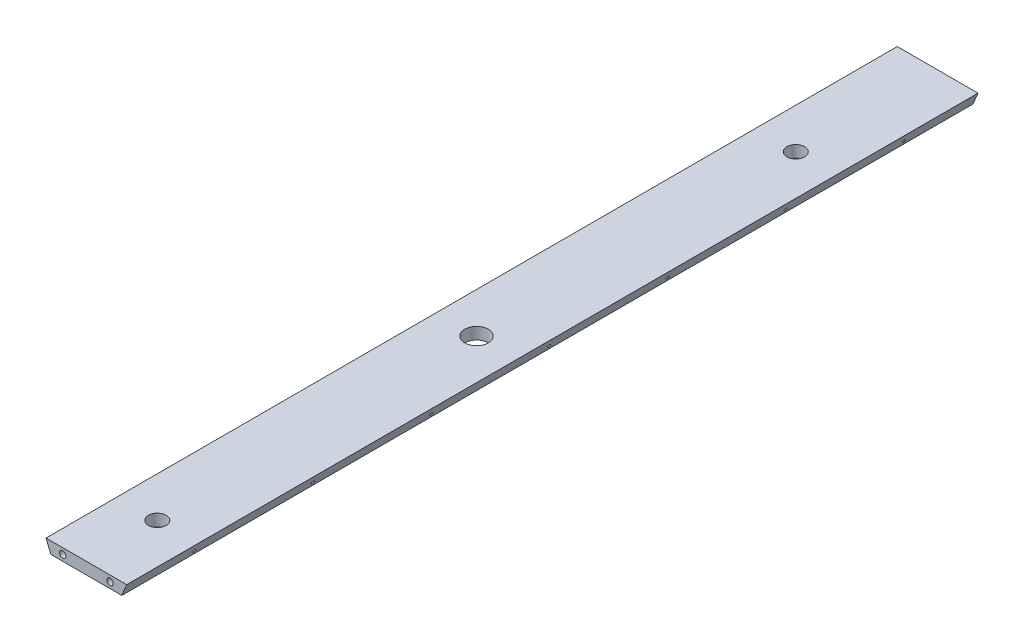
ISO-10303-21;
HEADER;
FILE_DESCRIPTION(('STEP AP214'),'2;1');
FILE_NAME('part.step','',(''),(''),'','','');
FILE_SCHEMA(('AUTOMOTIVE_DESIGN { 1 0 10303 214 1 1 1 1 }'));
ENDSEC;
DATA;
#1=APPLICATION_CONTEXT('core data for automotive mechanical design processes');
#2=APPLICATION_PROTOCOL_DEFINITION('international standard','automotive_design',2000,#1);
#3=PRODUCT_CONTEXT('',#1,'mechanical');
#4=PRODUCT('Part','Part','',(#3));
#5=PRODUCT_RELATED_PRODUCT_CATEGORY('part','',(#4));
#6=PRODUCT_DEFINITION_FORMATION('','',#4);
#7=PRODUCT_DEFINITION_CONTEXT('part definition',#1,'design');
#8=PRODUCT_DEFINITION('design','',#6,#7);
#9=PRODUCT_DEFINITION_SHAPE('','',#8);
#10=(LENGTH_UNIT() NAMED_UNIT(*) SI_UNIT(.MILLI.,.METRE.));
#11=(NAMED_UNIT(*) PLANE_ANGLE_UNIT() SI_UNIT($,.RADIAN.));
#12=(NAMED_UNIT(*) SI_UNIT($,.STERADIAN.) SOLID_ANGLE_UNIT());
#13=UNCERTAINTY_MEASURE_WITH_UNIT(LENGTH_MEASURE(1.E-05),#10,'distance_accuracy_value','');
#14=(GEOMETRIC_REPRESENTATION_CONTEXT(3) GLOBAL_UNCERTAINTY_ASSIGNED_CONTEXT((#13)) GLOBAL_UNIT_ASSIGNED_CONTEXT((#10,
#11,#12)) REPRESENTATION_CONTEXT('',''));
#15=CARTESIAN_POINT('',(0.,0.,0.));
#16=DIRECTION('',(0.,0.,1.));
#17=DIRECTION('',(1.,0.,0.));
#18=AXIS2_PLACEMENT_3D('',#15,#16,#17);
#19=CARTESIAN_POINT('',(19.05,45.9907683632075,457.2));
#20=DIRECTION('',(0.,1.,0.));
#21=DIRECTION('',(0.,0.,1.));
#22=AXIS2_PLACEMENT_3D('',#19,#20,#21);
#23=PLANE('',#22);
#24=CARTESIAN_POINT('',(0.,45.9907683632075,76.2));
#25=DIRECTION('',(0.,1.,0.));
#26=DIRECTION('',(-1.,0.,0.));
#27=AXIS2_PLACEMENT_3D('',#24,#25,#26);
#28=CIRCLE('',#27,4.76250000000001);
#29=CARTESIAN_POINT('',(-4.7625,45.9907683632075,76.2));
#30=VERTEX_POINT('',#29);
#31=EDGE_CURVE('E187',#30,#30,#28,.T.);
#32=ORIENTED_EDGE('',*,*,#31,.T.);
#33=EDGE_LOOP('',(#32));
#34=FACE_BOUND('',#33,.T.);
#35=CARTESIAN_POINT('',(0.,45.9907683632075,419.1));
#36=DIRECTION('',(0.,1.,0.));
#37=DIRECTION('',(-1.,0.,0.));
#38=AXIS2_PLACEMENT_3D('',#35,#36,#37);
#39=CIRCLE('',#38,4.7625);
#40=CARTESIAN_POINT('',(-4.76249999999995,45.9907683632075,419.1));
#41=VERTEX_POINT('',#40);
#42=EDGE_CURVE('E191',#41,#41,#39,.T.);
#43=ORIENTED_EDGE('',*,*,#42,.T.);
#44=EDGE_LOOP('',(#43));
#45=FACE_BOUND('',#44,.T.);
#46=CARTESIAN_POINT('',(0.,45.9907683632075,247.65));
#47=DIRECTION('',(0.,1.,0.));
#48=DIRECTION('',(-1.,0.,0.));
#49=AXIS2_PLACEMENT_3D('',#46,#47,#48);
#50=CIRCLE('',#49,6.35);
#51=CARTESIAN_POINT('',(-6.34999999999996,45.9907683632075,247.65));
#52=VERTEX_POINT('',#51);
#53=EDGE_CURVE('E194',#52,#52,#50,.T.);
#54=ORIENTED_EDGE('',*,*,#53,.T.);
#55=EDGE_LOOP('',(#54));
#56=FACE_BOUND('',#55,.T.);
#57=DIRECTION('',(1.,0.,0.));
#58=VECTOR('',#57,1.);
#59=CARTESIAN_POINT('',(19.05,45.9907683632075,0.));
#60=LINE('',#59,#58);
#61=CARTESIAN_POINT('',(-19.05,45.9907683632075,0.));
#62=VERTEX_POINT('',#61);
#63=CARTESIAN_POINT('',(19.05,45.9907683632075,0.));
#64=VERTEX_POINT('',#63);
#65=EDGE_CURVE('E134',#62,#64,#60,.T.);
#66=ORIENTED_EDGE('',*,*,#65,.T.);
#67=DIRECTION('',(0.,0.,-1.));
#68=VECTOR('',#67,1.);
#69=CARTESIAN_POINT('',(19.05,45.9907683632075,457.2));
#70=LINE('',#69,#68);
#71=CARTESIAN_POINT('',(19.05,45.9907683632075,457.2));
#72=VERTEX_POINT('',#71);
#73=EDGE_CURVE('E12',#72,#64,#70,.T.);
#74=ORIENTED_EDGE('',*,*,#73,.F.);
#75=DIRECTION('',(1.,0.,0.));
#76=VECTOR('',#75,1.);
#77=CARTESIAN_POINT('',(19.05,45.9907683632075,457.2));
#78=LINE('',#77,#76);
#79=CARTESIAN_POINT('',(-19.05,45.9907683632075,457.2));
#80=VERTEX_POINT('',#79);
#81=EDGE_CURVE('E135',#80,#72,#78,.T.);
#82=ORIENTED_EDGE('',*,*,#81,.F.);
#83=DIRECTION('',(0.,0.,-1.));
#84=VECTOR('',#83,1.);
#85=CARTESIAN_POINT('',(-19.05,45.9907683632075,457.2));
#86=LINE('',#85,#84);
#87=EDGE_CURVE('E141',#80,#62,#86,.T.);
#88=ORIENTED_EDGE('',*,*,#87,.T.);
#89=EDGE_LOOP('',(#66,#74,#82,#88));
#90=FACE_BOUND('',#89,.T.);
#91=ADVANCED_FACE('F39',(#34,#45,#56,#90),#23,.F.);
#92=CARTESIAN_POINT('',(21.6802561210692,52.3407683632075,457.2));
#93=DIRECTION('',(-0.923879532511287,0.38268343236509,0.));
#94=DIRECTION('',(-0.38268343236509,-0.923879532511287,0.));
#95=AXIS2_PLACEMENT_3D('',#92,#93,#94);
#96=PLANE('',#95);
#97=CARTESIAN_POINT('',(19.9612649233194,48.1907564999999,38.1));
#98=DIRECTION('',(0.923879532511287,-0.38268343236509,0.));
#99=DIRECTION('',(0.38268343236509,0.923879532511287,0.));
#100=AXIS2_PLACEMENT_3D('',#97,#98,#99);
#101=CIRCLE('',#100,0.793749999999904);
#102=CARTESIAN_POINT('',(20.2650198977592,48.9240858789307,38.1));
#103=VERTEX_POINT('',#102);
#104=EDGE_CURVE('E243',#103,#103,#101,.T.);
#105=ORIENTED_EDGE('',*,*,#104,.F.);
#106=EDGE_LOOP('',(#105));
#107=FACE_BOUND('',#106,.T.);
#108=CARTESIAN_POINT('',(19.9612649233194,48.1907564999999,101.6));
#109=DIRECTION('',(0.923879532511287,-0.38268343236509,0.));
#110=DIRECTION('',(0.38268343236509,0.923879532511287,0.));
#111=AXIS2_PLACEMENT_3D('',#108,#109,#110);
#112=CIRCLE('',#111,0.793749999999917);
#113=CARTESIAN_POINT('',(20.2650198977592,48.9240858789307,101.6));
#114=VERTEX_POINT('',#113);
#115=EDGE_CURVE('E249',#114,#114,#112,.T.);
#116=ORIENTED_EDGE('',*,*,#115,.F.);
#117=EDGE_LOOP('',(#116));
#118=FACE_BOUND('',#117,.T.);
#119=CARTESIAN_POINT('',(19.9612649233194,48.1907564999999,165.1));
#120=DIRECTION('',(0.923879532511287,-0.38268343236509,0.));
#121=DIRECTION('',(0.38268343236509,0.923879532511287,0.));
#122=AXIS2_PLACEMENT_3D('',#119,#120,#121);
#123=CIRCLE('',#122,0.793749999999904);
#124=CARTESIAN_POINT('',(20.2650198977591,48.9240858789307,165.1));
#125=VERTEX_POINT('',#124);
#126=EDGE_CURVE('E255',#125,#125,#123,.T.);
#127=ORIENTED_EDGE('',*,*,#126,.F.);
#128=EDGE_LOOP('',(#127));
#129=FACE_BOUND('',#128,.T.);
#130=CARTESIAN_POINT('',(19.9612649233194,48.1907564999999,228.6));
#131=DIRECTION('',(0.923879532511287,-0.38268343236509,0.));
#132=DIRECTION('',(0.38268343236509,0.923879532511287,0.));
#133=AXIS2_PLACEMENT_3D('',#130,#131,#132);
#134=CIRCLE('',#133,0.793749999999906);
#135=CARTESIAN_POINT('',(20.2650198977591,48.9240858789307,228.6));
#136=VERTEX_POINT('',#135);
#137=EDGE_CURVE('E261',#136,#136,#134,.T.);
#138=ORIENTED_EDGE('',*,*,#137,.F.);
#139=EDGE_LOOP('',(#138));
#140=FACE_BOUND('',#139,.T.);
#141=CARTESIAN_POINT('',(19.9612649233194,48.1907564999999,292.1));
#142=DIRECTION('',(0.923879532511287,-0.38268343236509,0.));
#143=DIRECTION('',(0.38268343236509,0.923879532511287,0.));
#144=AXIS2_PLACEMENT_3D('',#141,#142,#143);
#145=CIRCLE('',#144,0.793749999999908);
#146=CARTESIAN_POINT('',(20.2650198977591,48.9240858789307,292.1));
#147=VERTEX_POINT('',#146);
#148=EDGE_CURVE('E267',#147,#147,#145,.T.);
#149=ORIENTED_EDGE('',*,*,#148,.F.);
#150=EDGE_LOOP('',(#149));
#151=FACE_BOUND('',#150,.T.);
#152=CARTESIAN_POINT('',(19.9612649233194,48.1907564999999,355.6));
#153=DIRECTION('',(0.923879532511287,-0.38268343236509,0.));
#154=DIRECTION('',(0.38268343236509,0.923879532511287,0.));
#155=AXIS2_PLACEMENT_3D('',#152,#153,#154);
#156=CIRCLE('',#155,0.793749999999908);
#157=CARTESIAN_POINT('',(20.2650198977591,48.9240858789306,355.6));
#158=VERTEX_POINT('',#157);
#159=EDGE_CURVE('E273',#158,#158,#156,.T.);
#160=ORIENTED_EDGE('',*,*,#159,.F.);
#161=EDGE_LOOP('',(#160));
#162=FACE_BOUND('',#161,.T.);
#163=CARTESIAN_POINT('',(19.9612649233194,48.1907564999999,419.1));
#164=DIRECTION('',(0.923879532511287,-0.38268343236509,0.));
#165=DIRECTION('',(0.38268343236509,0.923879532511287,0.));
#166=AXIS2_PLACEMENT_3D('',#163,#164,#165);
#167=CIRCLE('',#166,0.793749999999906);
#168=CARTESIAN_POINT('',(20.2650198977591,48.9240858789306,419.1));
#169=VERTEX_POINT('',#168);
#170=EDGE_CURVE('E279',#169,#169,#167,.T.);
#171=ORIENTED_EDGE('',*,*,#170,.F.);
#172=EDGE_LOOP('',(#171));
#173=FACE_BOUND('',#172,.T.);
#174=DIRECTION('',(0.38268343236509,0.923879532511287,0.));
#175=VECTOR('',#174,1.);
#176=CARTESIAN_POINT('',(21.6802561210692,52.3407683632075,0.));
#177=LINE('',#176,#175);
#178=CARTESIAN_POINT('',(21.6802561210692,52.3407683632075,0.));
#179=VERTEX_POINT('',#178);
#180=EDGE_CURVE('E144',#64,#179,#177,.T.);
#181=ORIENTED_EDGE('',*,*,#180,.T.);
#182=DIRECTION('',(0.,0.,-1.));
#183=VECTOR('',#182,1.);
#184=CARTESIAN_POINT('',(21.6802561210692,52.3407683632075,457.2));
#185=LINE('',#184,#183);
#186=CARTESIAN_POINT('',(21.6802561210692,52.3407683632075,457.2));
#187=VERTEX_POINT('',#186);
#188=EDGE_CURVE('E47',#187,#179,#185,.T.);
#189=ORIENTED_EDGE('',*,*,#188,.F.);
#190=DIRECTION('',(0.38268343236509,0.923879532511287,0.));
#191=VECTOR('',#190,1.);
#192=CARTESIAN_POINT('',(21.6802561210692,52.3407683632075,457.2));
#193=LINE('',#192,#191);
#194=EDGE_CURVE('E86',#72,#187,#193,.T.);
#195=ORIENTED_EDGE('',*,*,#194,.F.);
#196=ORIENTED_EDGE('',*,*,#73,.T.);
#197=EDGE_LOOP('',(#181,#189,#195,#196));
#198=FACE_BOUND('',#197,.T.);
#199=ADVANCED_FACE('F171',(#107,#118,#129,#140,#151,#162,#173,#198),#96,.F.);
#200=CARTESIAN_POINT('',(-21.6802561210692,52.3407683632075,457.2));
#201=DIRECTION('',(0.,-1.,0.));
#202=DIRECTION('',(1.,0.,0.));
#203=AXIS2_PLACEMENT_3D('',#200,#201,#202);
#204=PLANE('',#203);
#205=CARTESIAN_POINT('',(0.,52.3407683632075,76.2));
#206=DIRECTION('',(0.,1.,0.));
#207=DIRECTION('',(-1.,0.,0.));
#208=AXIS2_PLACEMENT_3D('',#205,#206,#207);
#209=CIRCLE('',#208,4.76250000000001);
#210=CARTESIAN_POINT('',(-4.7625,52.3407683632075,76.2));
#211=VERTEX_POINT('',#210);
#212=EDGE_CURVE('E734',#211,#211,#209,.T.);
#213=ORIENTED_EDGE('',*,*,#212,.F.);
#214=EDGE_LOOP('',(#213));
#215=FACE_BOUND('',#214,.T.);
#216=CARTESIAN_POINT('',(0.,52.3407683632075,419.1));
#217=DIRECTION('',(0.,1.,0.));
#218=DIRECTION('',(-1.,0.,0.));
#219=AXIS2_PLACEMENT_3D('',#216,#217,#218);
#220=CIRCLE('',#219,4.7625);
#221=CARTESIAN_POINT('',(-4.76249999999994,52.3407683632075,419.1));
#222=VERTEX_POINT('',#221);
#223=EDGE_CURVE('E204',#222,#222,#220,.T.);
#224=ORIENTED_EDGE('',*,*,#223,.F.);
#225=EDGE_LOOP('',(#224));
#226=FACE_BOUND('',#225,.T.);
#227=CARTESIAN_POINT('',(0.,52.3407683632075,247.65));
#228=DIRECTION('',(0.,1.,0.));
#229=DIRECTION('',(-1.,0.,0.));
#230=AXIS2_PLACEMENT_3D('',#227,#228,#229);
#231=CIRCLE('',#230,6.35);
#232=CARTESIAN_POINT('',(-6.34999999999996,52.3407683632075,247.65));
#233=VERTEX_POINT('',#232);
#234=EDGE_CURVE('E197',#233,#233,#231,.T.);
#235=ORIENTED_EDGE('',*,*,#234,.F.);
#236=EDGE_LOOP('',(#235));
#237=FACE_BOUND('',#236,.T.);
#238=DIRECTION('',(-1.,0.,0.));
#239=VECTOR('',#238,1.);
#240=CARTESIAN_POINT('',(-21.6802561210692,52.3407683632075,0.));
#241=LINE('',#240,#239);
#242=CARTESIAN_POINT('',(-21.6802561210692,52.3407683632075,0.));
#243=VERTEX_POINT('',#242);
#244=EDGE_CURVE('E73',#179,#243,#241,.T.);
#245=ORIENTED_EDGE('',*,*,#244,.T.);
#246=DIRECTION('',(0.,0.,-1.));
#247=VECTOR('',#246,1.);
#248=CARTESIAN_POINT('',(-21.6802561210692,52.3407683632075,457.2));
#249=LINE('',#248,#247);
#250=CARTESIAN_POINT('',(-21.6802561210692,52.3407683632075,457.2));
#251=VERTEX_POINT('',#250);
#252=EDGE_CURVE('E149',#251,#243,#249,.T.);
#253=ORIENTED_EDGE('',*,*,#252,.F.);
#254=DIRECTION('',(-1.,0.,0.));
#255=VECTOR('',#254,1.);
#256=CARTESIAN_POINT('',(-21.6802561210692,52.3407683632075,457.2));
#257=LINE('',#256,#255);
#258=EDGE_CURVE('E138',#187,#251,#257,.T.);
#259=ORIENTED_EDGE('',*,*,#258,.F.);
#260=ORIENTED_EDGE('',*,*,#188,.T.);
#261=EDGE_LOOP('',(#245,#253,#259,#260));
#262=FACE_BOUND('',#261,.T.);
#263=ADVANCED_FACE('F151',(#215,#226,#237,#262),#204,.F.);
#264=CARTESIAN_POINT('',(-19.05,45.9907683632075,457.2));
#265=DIRECTION('',(0.923879532511287,0.38268343236509,0.));
#266=DIRECTION('',(-0.38268343236509,0.923879532511287,0.));
#267=AXIS2_PLACEMENT_3D('',#264,#265,#266);
#268=PLANE('',#267);
#269=CARTESIAN_POINT('',(-19.9612649233194,48.1907564999999,38.1));
#270=DIRECTION('',(0.923879532511287,0.38268343236509,0.));
#271=DIRECTION('',(-0.38268343236509,0.923879532511287,0.));
#272=AXIS2_PLACEMENT_3D('',#269,#270,#271);
#273=CIRCLE('',#272,0.793749999999904);
#274=CARTESIAN_POINT('',(-20.2650198977592,48.9240858789307,38.1));
#275=VERTEX_POINT('',#274);
#276=EDGE_CURVE('E196',#275,#275,#273,.T.);
#277=ORIENTED_EDGE('',*,*,#276,.T.);
#278=EDGE_LOOP('',(#277));
#279=FACE_BOUND('',#278,.T.);
#280=CARTESIAN_POINT('',(-19.9612649233194,48.1907564999999,101.6));
#281=DIRECTION('',(0.923879532511287,0.38268343236509,0.));
#282=DIRECTION('',(-0.38268343236509,0.923879532511287,0.));
#283=AXIS2_PLACEMENT_3D('',#280,#281,#282);
#284=CIRCLE('',#283,0.793749999999917);
#285=CARTESIAN_POINT('',(-20.2650198977592,48.9240858789307,101.6));
#286=VERTEX_POINT('',#285);
#287=EDGE_CURVE('E208',#286,#286,#284,.T.);
#288=ORIENTED_EDGE('',*,*,#287,.T.);
#289=EDGE_LOOP('',(#288));
#290=FACE_BOUND('',#289,.T.);
#291=CARTESIAN_POINT('',(-19.9612649233194,48.1907564999999,165.1));
#292=DIRECTION('',(0.923879532511287,0.38268343236509,0.));
#293=DIRECTION('',(-0.38268343236509,0.923879532511287,0.));
#294=AXIS2_PLACEMENT_3D('',#291,#292,#293);
#295=CIRCLE('',#294,0.793749999999904);
#296=CARTESIAN_POINT('',(-20.2650198977591,48.9240858789307,165.1));
#297=VERTEX_POINT('',#296);
#298=EDGE_CURVE('E213',#297,#297,#295,.T.);
#299=ORIENTED_EDGE('',*,*,#298,.T.);
#300=EDGE_LOOP('',(#299));
#301=FACE_BOUND('',#300,.T.);
#302=CARTESIAN_POINT('',(-19.9612649233194,48.1907564999999,228.6));
#303=DIRECTION('',(0.923879532511287,0.38268343236509,0.));
#304=DIRECTION('',(-0.38268343236509,0.923879532511287,0.));
#305=AXIS2_PLACEMENT_3D('',#302,#303,#304);
#306=CIRCLE('',#305,0.793749999999906);
#307=CARTESIAN_POINT('',(-20.2650198977591,48.9240858789307,228.6));
#308=VERTEX_POINT('',#307);
#309=EDGE_CURVE('E219',#308,#308,#306,.T.);
#310=ORIENTED_EDGE('',*,*,#309,.T.);
#311=EDGE_LOOP('',(#310));
#312=FACE_BOUND('',#311,.T.);
#313=CARTESIAN_POINT('',(-19.9612649233194,48.1907564999999,292.1));
#314=DIRECTION('',(0.923879532511287,0.38268343236509,0.));
#315=DIRECTION('',(-0.38268343236509,0.923879532511287,0.));
#316=AXIS2_PLACEMENT_3D('',#313,#314,#315);
#317=CIRCLE('',#316,0.793749999999908);
#318=CARTESIAN_POINT('',(-20.2650198977591,48.9240858789307,292.1));
#319=VERTEX_POINT('',#318);
#320=EDGE_CURVE('E225',#319,#319,#317,.T.);
#321=ORIENTED_EDGE('',*,*,#320,.T.);
#322=EDGE_LOOP('',(#321));
#323=FACE_BOUND('',#322,.T.);
#324=CARTESIAN_POINT('',(-19.9612649233194,48.1907564999999,355.6));
#325=DIRECTION('',(0.923879532511287,0.38268343236509,0.));
#326=DIRECTION('',(-0.38268343236509,0.923879532511287,0.));
#327=AXIS2_PLACEMENT_3D('',#324,#325,#326);
#328=CIRCLE('',#327,0.793749999999908);
#329=CARTESIAN_POINT('',(-20.2650198977591,48.9240858789306,355.6));
#330=VERTEX_POINT('',#329);
#331=EDGE_CURVE('E231',#330,#330,#328,.T.);
#332=ORIENTED_EDGE('',*,*,#331,.T.);
#333=EDGE_LOOP('',(#332));
#334=FACE_BOUND('',#333,.T.);
#335=CARTESIAN_POINT('',(-19.9612649233194,48.1907564999999,419.1));
#336=DIRECTION('',(0.923879532511287,0.38268343236509,0.));
#337=DIRECTION('',(-0.38268343236509,0.923879532511287,0.));
#338=AXIS2_PLACEMENT_3D('',#335,#336,#337);
#339=CIRCLE('',#338,0.793749999999906);
#340=CARTESIAN_POINT('',(-20.2650198977591,48.9240858789306,419.1));
#341=VERTEX_POINT('',#340);
#342=EDGE_CURVE('E237',#341,#341,#339,.T.);
#343=ORIENTED_EDGE('',*,*,#342,.T.);
#344=EDGE_LOOP('',(#343));
#345=FACE_BOUND('',#344,.T.);
#346=DIRECTION('',(0.38268343236509,-0.923879532511287,0.));
#347=VECTOR('',#346,1.);
#348=CARTESIAN_POINT('',(-19.05,45.9907683632075,0.));
#349=LINE('',#348,#347);
#350=EDGE_CURVE('E79',#243,#62,#349,.T.);
#351=ORIENTED_EDGE('',*,*,#350,.T.);
#352=ORIENTED_EDGE('',*,*,#87,.F.);
#353=DIRECTION('',(0.38268343236509,-0.923879532511287,0.));
#354=VECTOR('',#353,1.);
#355=CARTESIAN_POINT('',(-19.05,45.9907683632075,457.2));
#356=LINE('',#355,#354);
#357=EDGE_CURVE('E55',#251,#80,#356,.T.);
#358=ORIENTED_EDGE('',*,*,#357,.F.);
#359=ORIENTED_EDGE('',*,*,#252,.T.);
#360=EDGE_LOOP('',(#351,#352,#358,#359));
#361=FACE_BOUND('',#360,.T.);
#362=ADVANCED_FACE('F158',(#279,#290,#301,#312,#323,#334,#345,#361),#268,.F.);
#363=CARTESIAN_POINT('',(0.,0.,457.2));
#364=DIRECTION('',(0.,0.,-1.));
#365=DIRECTION('',(-1.,0.,0.));
#366=AXIS2_PLACEMENT_3D('',#363,#364,#365);
#367=PLANE('',#366);
#368=CARTESIAN_POINT('',(-12.7,49.1657683632075,457.2));
#369=DIRECTION('',(0.,0.,1.));
#370=DIRECTION('',(1.,0.,0.));
#371=AXIS2_PLACEMENT_3D('',#368,#369,#370);
#372=CIRCLE('',#371,1.72719999999999);
#373=CARTESIAN_POINT('',(-10.9728,49.1657683632075,457.2));
#374=VERTEX_POINT('',#373);
#375=EDGE_CURVE('E110',#374,#374,#372,.T.);
#376=ORIENTED_EDGE('',*,*,#375,.F.);
#377=EDGE_LOOP('',(#376));
#378=FACE_BOUND('',#377,.T.);
#379=CARTESIAN_POINT('',(12.7,49.1657683632075,457.2));
#380=DIRECTION('',(0.,0.,1.));
#381=DIRECTION('',(1.,0.,0.));
#382=AXIS2_PLACEMENT_3D('',#379,#380,#381);
#383=CIRCLE('',#382,1.72719999999999);
#384=CARTESIAN_POINT('',(14.4272,49.1657683632075,457.2));
#385=VERTEX_POINT('',#384);
#386=EDGE_CURVE('E109',#385,#385,#383,.T.);
#387=ORIENTED_EDGE('',*,*,#386,.F.);
#388=EDGE_LOOP('',(#387));
#389=FACE_BOUND('',#388,.T.);
#390=ORIENTED_EDGE('',*,*,#81,.T.);
#391=ORIENTED_EDGE('',*,*,#194,.T.);
#392=ORIENTED_EDGE('',*,*,#258,.T.);
#393=ORIENTED_EDGE('',*,*,#357,.T.);
#394=EDGE_LOOP('',(#390,#391,#392,#393));
#395=FACE_BOUND('',#394,.T.);
#396=ADVANCED_FACE('F160',(#378,#389,#395),#367,.F.);
#397=CARTESIAN_POINT('',(0.,0.,0.));
#398=DIRECTION('',(0.,0.,-1.));
#399=DIRECTION('',(-1.,0.,0.));
#400=AXIS2_PLACEMENT_3D('',#397,#398,#399);
#401=PLANE('',#400);
#402=CARTESIAN_POINT('',(-12.7,49.1657683632075,0.));
#403=DIRECTION('',(0.,0.,-1.));
#404=DIRECTION('',(-1.,0.,0.));
#405=AXIS2_PLACEMENT_3D('',#402,#403,#404);
#406=CIRCLE('',#405,1.72719999999999);
#407=CARTESIAN_POINT('',(-14.4272,49.1657683632075,0.));
#408=VERTEX_POINT('',#407);
#409=EDGE_CURVE('E122',#408,#408,#406,.T.);
#410=ORIENTED_EDGE('',*,*,#409,.F.);
#411=EDGE_LOOP('',(#410));
#412=FACE_BOUND('',#411,.T.);
#413=CARTESIAN_POINT('',(12.7,49.1657683632075,0.));
#414=DIRECTION('',(0.,0.,-1.));
#415=DIRECTION('',(-1.,0.,0.));
#416=AXIS2_PLACEMENT_3D('',#413,#414,#415);
#417=CIRCLE('',#416,1.72719999999999);
#418=CARTESIAN_POINT('',(10.9728,49.1657683632075,0.));
#419=VERTEX_POINT('',#418);
#420=EDGE_CURVE('E128',#419,#419,#417,.T.);
#421=ORIENTED_EDGE('',*,*,#420,.F.);
#422=EDGE_LOOP('',(#421));
#423=FACE_BOUND('',#422,.T.);
#424=ORIENTED_EDGE('',*,*,#65,.F.);
#425=ORIENTED_EDGE('',*,*,#350,.F.);
#426=ORIENTED_EDGE('',*,*,#244,.F.);
#427=ORIENTED_EDGE('',*,*,#180,.F.);
#428=EDGE_LOOP('',(#424,#425,#426,#427));
#429=FACE_BOUND('',#428,.T.);
#430=ADVANCED_FACE('F154',(#412,#423,#429),#401,.T.);
#431=CARTESIAN_POINT('',(12.7,49.1657683632075,25.4));
#432=DIRECTION('',(0.,0.,-1.));
#433=DIRECTION('',(-1.,0.,0.));
#434=AXIS2_PLACEMENT_3D('',#431,#432,#433);
#435=CONICAL_SURFACE('',#434,1.7272,1.02974425867665);
#436=CARTESIAN_POINT('',(12.7,49.1657683632075,26.4378064611844));
#437=VERTEX_POINT('',#436);
#438=VERTEX_LOOP('',#437);
#439=FACE_BOUND('',#438,.T.);
#440=CARTESIAN_POINT('',(12.7,49.1657683632075,25.4));
#441=DIRECTION('',(0.,0.,-1.));
#442=DIRECTION('',(-1.,0.,0.));
#443=AXIS2_PLACEMENT_3D('',#440,#441,#442);
#444=CIRCLE('',#443,1.7272);
#445=CARTESIAN_POINT('',(10.9728,49.1657683632075,25.4));
#446=VERTEX_POINT('',#445);
#447=EDGE_CURVE('E131',#446,#446,#444,.T.);
#448=ORIENTED_EDGE('',*,*,#447,.T.);
#449=EDGE_LOOP('',(#448));
#450=FACE_BOUND('',#449,.T.);
#451=ADVANCED_FACE('F322',(#439,#450),#435,.F.);
#452=CARTESIAN_POINT('',(12.7,49.1657683632075,0.));
#453=DIRECTION('',(0.,0.,-1.));
#454=DIRECTION('',(-1.,0.,0.));
#455=AXIS2_PLACEMENT_3D('',#452,#453,#454);
#456=CYLINDRICAL_SURFACE('',#455,1.72719999999999);
#457=ORIENTED_EDGE('',*,*,#447,.F.);
#458=EDGE_LOOP('',(#457));
#459=FACE_BOUND('',#458,.T.);
#460=ORIENTED_EDGE('',*,*,#420,.T.);
#461=EDGE_LOOP('',(#460));
#462=FACE_BOUND('',#461,.T.);
#463=ADVANCED_FACE('F318',(#459,#462),#456,.F.);
#464=CARTESIAN_POINT('',(-12.7,49.1657683632075,25.4));
#465=DIRECTION('',(0.,0.,-1.));
#466=DIRECTION('',(-1.,0.,0.));
#467=AXIS2_PLACEMENT_3D('',#464,#465,#466);
#468=CONICAL_SURFACE('',#467,1.7272,1.02974425867665);
#469=CARTESIAN_POINT('',(-12.7,49.1657683632075,26.4378064611844));
#470=VERTEX_POINT('',#469);
#471=VERTEX_LOOP('',#470);
#472=FACE_BOUND('',#471,.T.);
#473=CARTESIAN_POINT('',(-12.7,49.1657683632075,25.4));
#474=DIRECTION('',(0.,0.,-1.));
#475=DIRECTION('',(-1.,0.,0.));
#476=AXIS2_PLACEMENT_3D('',#473,#474,#475);
#477=CIRCLE('',#476,1.7272);
#478=CARTESIAN_POINT('',(-14.4272,49.1657683632075,25.4));
#479=VERTEX_POINT('',#478);
#480=EDGE_CURVE('E125',#479,#479,#477,.T.);
#481=ORIENTED_EDGE('',*,*,#480,.T.);
#482=EDGE_LOOP('',(#481));
#483=FACE_BOUND('',#482,.T.);
#484=ADVANCED_FACE('F314',(#472,#483),#468,.F.);
#485=CARTESIAN_POINT('',(-12.7,49.1657683632075,0.));
#486=DIRECTION('',(0.,0.,-1.));
#487=DIRECTION('',(-1.,0.,0.));
#488=AXIS2_PLACEMENT_3D('',#485,#486,#487);
#489=CYLINDRICAL_SURFACE('',#488,1.72719999999999);
#490=ORIENTED_EDGE('',*,*,#480,.F.);
#491=EDGE_LOOP('',(#490));
#492=FACE_BOUND('',#491,.T.);
#493=ORIENTED_EDGE('',*,*,#409,.T.);
#494=EDGE_LOOP('',(#493));
#495=FACE_BOUND('',#494,.T.);
#496=ADVANCED_FACE('F310',(#492,#495),#489,.F.);
#497=CARTESIAN_POINT('',(12.7,49.1657683632075,431.8));
#498=DIRECTION('',(0.,0.,1.));
#499=DIRECTION('',(1.,0.,0.));
#500=AXIS2_PLACEMENT_3D('',#497,#498,#499);
#501=CONICAL_SURFACE('',#500,1.7272,1.02974425867665);
#502=CARTESIAN_POINT('',(12.7,49.1657683632075,430.762193538816));
#503=VERTEX_POINT('',#502);
#504=VERTEX_LOOP('',#503);
#505=FACE_BOUND('',#504,.T.);
#506=CARTESIAN_POINT('',(12.7,49.1657683632075,431.8));
#507=DIRECTION('',(0.,0.,1.));
#508=DIRECTION('',(1.,0.,0.));
#509=AXIS2_PLACEMENT_3D('',#506,#507,#508);
#510=CIRCLE('',#509,1.7272);
#511=CARTESIAN_POINT('',(14.4272,49.1657683632075,431.8));
#512=VERTEX_POINT('',#511);
#513=EDGE_CURVE('E113',#512,#512,#510,.T.);
#514=ORIENTED_EDGE('',*,*,#513,.T.);
#515=EDGE_LOOP('',(#514));
#516=FACE_BOUND('',#515,.T.);
#517=ADVANCED_FACE('F306',(#505,#516),#501,.F.);
#518=CARTESIAN_POINT('',(12.7,49.1657683632075,457.2));
#519=DIRECTION('',(0.,0.,1.));
#520=DIRECTION('',(1.,0.,0.));
#521=AXIS2_PLACEMENT_3D('',#518,#519,#520);
#522=CYLINDRICAL_SURFACE('',#521,1.72719999999999);
#523=ORIENTED_EDGE('',*,*,#513,.F.);
#524=EDGE_LOOP('',(#523));
#525=FACE_BOUND('',#524,.T.);
#526=ORIENTED_EDGE('',*,*,#386,.T.);
#527=EDGE_LOOP('',(#526));
#528=FACE_BOUND('',#527,.T.);
#529=ADVANCED_FACE('F103',(#525,#528),#522,.F.);
#530=CARTESIAN_POINT('',(-12.7,49.1657683632075,431.8));
#531=DIRECTION('',(0.,0.,1.));
#532=DIRECTION('',(1.,0.,0.));
#533=AXIS2_PLACEMENT_3D('',#530,#531,#532);
#534=CONICAL_SURFACE('',#533,1.7272,1.02974425867665);
#535=CARTESIAN_POINT('',(-12.7,49.1657683632075,430.762193538816));
#536=VERTEX_POINT('',#535);
#537=VERTEX_LOOP('',#536);
#538=FACE_BOUND('',#537,.T.);
#539=CARTESIAN_POINT('',(-12.7,49.1657683632075,431.8));
#540=DIRECTION('',(0.,0.,1.));
#541=DIRECTION('',(1.,0.,0.));
#542=AXIS2_PLACEMENT_3D('',#539,#540,#541);
#543=CIRCLE('',#542,1.7272);
#544=CARTESIAN_POINT('',(-10.9728,49.1657683632075,431.8));
#545=VERTEX_POINT('',#544);
#546=EDGE_CURVE('E107',#545,#545,#543,.T.);
#547=ORIENTED_EDGE('',*,*,#546,.T.);
#548=EDGE_LOOP('',(#547));
#549=FACE_BOUND('',#548,.T.);
#550=ADVANCED_FACE('F99',(#538,#549),#534,.F.);
#551=CARTESIAN_POINT('',(-12.7,49.1657683632075,457.2));
#552=DIRECTION('',(0.,0.,1.));
#553=DIRECTION('',(1.,0.,0.));
#554=AXIS2_PLACEMENT_3D('',#551,#552,#553);
#555=CYLINDRICAL_SURFACE('',#554,1.72719999999999);
#556=ORIENTED_EDGE('',*,*,#546,.F.);
#557=EDGE_LOOP('',(#556));
#558=FACE_BOUND('',#557,.T.);
#559=ORIENTED_EDGE('',*,*,#375,.T.);
#560=EDGE_LOOP('',(#559));
#561=FACE_BOUND('',#560,.T.);
#562=ADVANCED_FACE('F102',(#558,#561),#555,.F.);
#563=CARTESIAN_POINT('',(14.0946298918727,50.6207962955182,419.1));
#564=DIRECTION('',(0.923879532511287,-0.38268343236509,0.));
#565=DIRECTION('',(0.38268343236509,0.923879532511287,0.));
#566=AXIS2_PLACEMENT_3D('',#563,#564,#565);
#567=CYLINDRICAL_SURFACE('',#566,0.793749999999906);
#568=CARTESIAN_POINT('',(14.0946298918727,50.6207962955182,419.1));
#569=DIRECTION('',(0.923879532511287,-0.38268343236509,0.));
#570=DIRECTION('',(0.38268343236509,0.923879532511287,0.));
#571=AXIS2_PLACEMENT_3D('',#568,#569,#570);
#572=CIRCLE('',#571,0.793749999999906);
#573=CARTESIAN_POINT('',(14.3983848663124,51.354125674449,419.1));
#574=VERTEX_POINT('',#573);
#575=EDGE_CURVE('E116',#574,#574,#572,.T.);
#576=ORIENTED_EDGE('',*,*,#575,.F.);
#577=EDGE_LOOP('',(#576));
#578=FACE_BOUND('',#577,.T.);
#579=ORIENTED_EDGE('',*,*,#170,.T.);
#580=EDGE_LOOP('',(#579));
#581=FACE_BOUND('',#580,.T.);
#582=ADVANCED_FACE('F286',(#578,#581),#567,.F.);
#583=CARTESIAN_POINT('',(14.0946298918727,50.6207962955182,419.1));
#584=DIRECTION('',(0.923879532511287,-0.38268343236509,0.));
#585=DIRECTION('',(0.38268343236509,0.923879532511287,0.));
#586=AXIS2_PLACEMENT_3D('',#583,#584,#585);
#587=PLANE('',#586);
#588=ORIENTED_EDGE('',*,*,#575,.T.);
#589=EDGE_LOOP('',(#588));
#590=FACE_BOUND('',#589,.T.);
#591=ADVANCED_FACE('F289',(#590),#587,.T.);
#592=CARTESIAN_POINT('',(14.0946298918727,50.6207962955182,355.6));
#593=DIRECTION('',(0.923879532511287,-0.38268343236509,0.));
#594=DIRECTION('',(0.38268343236509,0.923879532511287,0.));
#595=AXIS2_PLACEMENT_3D('',#592,#593,#594);
#596=CYLINDRICAL_SURFACE('',#595,0.793749999999908);
#597=CARTESIAN_POINT('',(14.0946298918727,50.6207962955182,355.6));
#598=DIRECTION('',(0.923879532511287,-0.38268343236509,0.));
#599=DIRECTION('',(0.38268343236509,0.923879532511287,0.));
#600=AXIS2_PLACEMENT_3D('',#597,#598,#599);
#601=CIRCLE('',#600,0.793749999999908);
#602=CARTESIAN_POINT('',(14.3983848663124,51.354125674449,355.6));
#603=VERTEX_POINT('',#602);
#604=EDGE_CURVE('E276',#603,#603,#601,.T.);
#605=ORIENTED_EDGE('',*,*,#604,.F.);
#606=EDGE_LOOP('',(#605));
#607=FACE_BOUND('',#606,.T.);
#608=ORIENTED_EDGE('',*,*,#159,.T.);
#609=EDGE_LOOP('',(#608));
#610=FACE_BOUND('',#609,.T.);
#611=ADVANCED_FACE('F297',(#607,#610),#596,.F.);
#612=CARTESIAN_POINT('',(14.0946298918727,50.6207962955182,355.6));
#613=DIRECTION('',(0.923879532511287,-0.38268343236509,0.));
#614=DIRECTION('',(0.38268343236509,0.923879532511287,0.));
#615=AXIS2_PLACEMENT_3D('',#612,#613,#614);
#616=PLANE('',#615);
#617=ORIENTED_EDGE('',*,*,#604,.T.);
#618=EDGE_LOOP('',(#617));
#619=FACE_BOUND('',#618,.T.);
#620=ADVANCED_FACE('F397',(#619),#616,.T.);
#621=CARTESIAN_POINT('',(14.0946298918727,50.6207962955183,292.1));
#622=DIRECTION('',(0.923879532511287,-0.38268343236509,0.));
#623=DIRECTION('',(0.38268343236509,0.923879532511287,0.));
#624=AXIS2_PLACEMENT_3D('',#621,#622,#623);
#625=CYLINDRICAL_SURFACE('',#624,0.793749999999908);
#626=CARTESIAN_POINT('',(14.0946298918727,50.6207962955183,292.1));
#627=DIRECTION('',(0.923879532511287,-0.38268343236509,0.));
#628=DIRECTION('',(0.38268343236509,0.923879532511287,0.));
#629=AXIS2_PLACEMENT_3D('',#626,#627,#628);
#630=CIRCLE('',#629,0.793749999999908);
#631=CARTESIAN_POINT('',(14.3983848663124,51.354125674449,292.1));
#632=VERTEX_POINT('',#631);
#633=EDGE_CURVE('E270',#632,#632,#630,.T.);
#634=ORIENTED_EDGE('',*,*,#633,.F.);
#635=EDGE_LOOP('',(#634));
#636=FACE_BOUND('',#635,.T.);
#637=ORIENTED_EDGE('',*,*,#148,.T.);
#638=EDGE_LOOP('',(#637));
#639=FACE_BOUND('',#638,.T.);
#640=ADVANCED_FACE('F406',(#636,#639),#625,.F.);
#641=CARTESIAN_POINT('',(14.0946298918727,50.6207962955183,292.1));
#642=DIRECTION('',(0.923879532511287,-0.38268343236509,0.));
#643=DIRECTION('',(0.38268343236509,0.923879532511287,0.));
#644=AXIS2_PLACEMENT_3D('',#641,#642,#643);
#645=PLANE('',#644);
#646=ORIENTED_EDGE('',*,*,#633,.T.);
#647=EDGE_LOOP('',(#646));
#648=FACE_BOUND('',#647,.T.);
#649=ADVANCED_FACE('F416',(#648),#645,.T.);
#650=CARTESIAN_POINT('',(14.0946298918727,50.6207962955183,228.6));
#651=DIRECTION('',(0.923879532511287,-0.38268343236509,0.));
#652=DIRECTION('',(0.38268343236509,0.923879532511287,0.));
#653=AXIS2_PLACEMENT_3D('',#650,#651,#652);
#654=CYLINDRICAL_SURFACE('',#653,0.793749999999906);
#655=CARTESIAN_POINT('',(14.0946298918727,50.6207962955183,228.6));
#656=DIRECTION('',(0.923879532511287,-0.38268343236509,0.));
#657=DIRECTION('',(0.38268343236509,0.923879532511287,0.));
#658=AXIS2_PLACEMENT_3D('',#655,#656,#657);
#659=CIRCLE('',#658,0.793749999999906);
#660=CARTESIAN_POINT('',(14.3983848663124,51.354125674449,228.6));
#661=VERTEX_POINT('',#660);
#662=EDGE_CURVE('E264',#661,#661,#659,.T.);
#663=ORIENTED_EDGE('',*,*,#662,.F.);
#664=EDGE_LOOP('',(#663));
#665=FACE_BOUND('',#664,.T.);
#666=ORIENTED_EDGE('',*,*,#137,.T.);
#667=EDGE_LOOP('',(#666));
#668=FACE_BOUND('',#667,.T.);
#669=ADVANCED_FACE('F426',(#665,#668),#654,.F.);
#670=CARTESIAN_POINT('',(14.0946298918727,50.6207962955183,228.6));
#671=DIRECTION('',(0.923879532511287,-0.38268343236509,0.));
#672=DIRECTION('',(0.38268343236509,0.923879532511287,0.));
#673=AXIS2_PLACEMENT_3D('',#670,#671,#672);
#674=PLANE('',#673);
#675=ORIENTED_EDGE('',*,*,#662,.T.);
#676=EDGE_LOOP('',(#675));
#677=FACE_BOUND('',#676,.T.);
#678=ADVANCED_FACE('F436',(#677),#674,.T.);
#679=CARTESIAN_POINT('',(14.0946298918727,50.6207962955183,165.1));
#680=DIRECTION('',(0.923879532511287,-0.38268343236509,0.));
#681=DIRECTION('',(0.38268343236509,0.923879532511287,0.));
#682=AXIS2_PLACEMENT_3D('',#679,#680,#681);
#683=CYLINDRICAL_SURFACE('',#682,0.793749999999904);
#684=CARTESIAN_POINT('',(14.0946298918727,50.6207962955183,165.1));
#685=DIRECTION('',(0.923879532511287,-0.38268343236509,0.));
#686=DIRECTION('',(0.38268343236509,0.923879532511287,0.));
#687=AXIS2_PLACEMENT_3D('',#684,#685,#686);
#688=CIRCLE('',#687,0.793749999999904);
#689=CARTESIAN_POINT('',(14.3983848663124,51.354125674449,165.1));
#690=VERTEX_POINT('',#689);
#691=EDGE_CURVE('E258',#690,#690,#688,.T.);
#692=ORIENTED_EDGE('',*,*,#691,.F.);
#693=EDGE_LOOP('',(#692));
#694=FACE_BOUND('',#693,.T.);
#695=ORIENTED_EDGE('',*,*,#126,.T.);
#696=EDGE_LOOP('',(#695));
#697=FACE_BOUND('',#696,.T.);
#698=ADVANCED_FACE('F446',(#694,#697),#683,.F.);
#699=CARTESIAN_POINT('',(14.0946298918727,50.6207962955183,165.1));
#700=DIRECTION('',(0.923879532511287,-0.38268343236509,0.));
#701=DIRECTION('',(0.38268343236509,0.923879532511287,0.));
#702=AXIS2_PLACEMENT_3D('',#699,#700,#701);
#703=PLANE('',#702);
#704=ORIENTED_EDGE('',*,*,#691,.T.);
#705=EDGE_LOOP('',(#704));
#706=FACE_BOUND('',#705,.T.);
#707=ADVANCED_FACE('F456',(#706),#703,.T.);
#708=CARTESIAN_POINT('',(14.0946298918727,50.6207962955183,101.6));
#709=DIRECTION('',(0.923879532511287,-0.38268343236509,0.));
#710=DIRECTION('',(0.38268343236509,0.923879532511287,0.));
#711=AXIS2_PLACEMENT_3D('',#708,#709,#710);
#712=CYLINDRICAL_SURFACE('',#711,0.793749999999917);
#713=CARTESIAN_POINT('',(14.0946298918727,50.6207962955183,101.6));
#714=DIRECTION('',(0.923879532511287,-0.38268343236509,0.));
#715=DIRECTION('',(0.38268343236509,0.923879532511287,0.));
#716=AXIS2_PLACEMENT_3D('',#713,#714,#715);
#717=CIRCLE('',#716,0.793749999999917);
#718=CARTESIAN_POINT('',(14.3983848663124,51.354125674449,101.6));
#719=VERTEX_POINT('',#718);
#720=EDGE_CURVE('E252',#719,#719,#717,.T.);
#721=ORIENTED_EDGE('',*,*,#720,.F.);
#722=EDGE_LOOP('',(#721));
#723=FACE_BOUND('',#722,.T.);
#724=ORIENTED_EDGE('',*,*,#115,.T.);
#725=EDGE_LOOP('',(#724));
#726=FACE_BOUND('',#725,.T.);
#727=ADVANCED_FACE('F466',(#723,#726),#712,.F.);
#728=CARTESIAN_POINT('',(14.0946298918727,50.6207962955183,101.6));
#729=DIRECTION('',(0.923879532511287,-0.38268343236509,0.));
#730=DIRECTION('',(0.38268343236509,0.923879532511287,0.));
#731=AXIS2_PLACEMENT_3D('',#728,#729,#730);
#732=PLANE('',#731);
#733=ORIENTED_EDGE('',*,*,#720,.T.);
#734=EDGE_LOOP('',(#733));
#735=FACE_BOUND('',#734,.T.);
#736=ADVANCED_FACE('F476',(#735),#732,.T.);
#737=CARTESIAN_POINT('',(14.0946298918727,50.6207962955183,38.1));
#738=DIRECTION('',(0.923879532511287,-0.38268343236509,0.));
#739=DIRECTION('',(0.38268343236509,0.923879532511287,0.));
#740=AXIS2_PLACEMENT_3D('',#737,#738,#739);
#741=CYLINDRICAL_SURFACE('',#740,0.793749999999904);
#742=CARTESIAN_POINT('',(14.0946298918727,50.6207962955183,38.1));
#743=DIRECTION('',(0.923879532511287,-0.38268343236509,0.));
#744=DIRECTION('',(0.38268343236509,0.923879532511287,0.));
#745=AXIS2_PLACEMENT_3D('',#742,#743,#744);
#746=CIRCLE('',#745,0.793749999999904);
#747=CARTESIAN_POINT('',(14.3983848663124,51.354125674449,38.1));
#748=VERTEX_POINT('',#747);
#749=EDGE_CURVE('E246',#748,#748,#746,.T.);
#750=ORIENTED_EDGE('',*,*,#749,.F.);
#751=EDGE_LOOP('',(#750));
#752=FACE_BOUND('',#751,.T.);
#753=ORIENTED_EDGE('',*,*,#104,.T.);
#754=EDGE_LOOP('',(#753));
#755=FACE_BOUND('',#754,.T.);
#756=ADVANCED_FACE('F486',(#752,#755),#741,.F.);
#757=CARTESIAN_POINT('',(14.0946298918727,50.6207962955183,38.1));
#758=DIRECTION('',(0.923879532511287,-0.38268343236509,0.));
#759=DIRECTION('',(0.38268343236509,0.923879532511287,0.));
#760=AXIS2_PLACEMENT_3D('',#757,#758,#759);
#761=PLANE('',#760);
#762=ORIENTED_EDGE('',*,*,#749,.T.);
#763=EDGE_LOOP('',(#762));
#764=FACE_BOUND('',#763,.T.);
#765=ADVANCED_FACE('F496',(#764),#761,.T.);
#766=CARTESIAN_POINT('',(-14.0946298918727,50.6207962955182,419.1));
#767=DIRECTION('',(-0.923879532511287,-0.38268343236509,0.));
#768=DIRECTION('',(0.38268343236509,-0.923879532511287,0.));
#769=AXIS2_PLACEMENT_3D('',#766,#767,#768);
#770=CYLINDRICAL_SURFACE('',#769,0.793749999999906);
#771=CARTESIAN_POINT('',(-14.0946298918727,50.6207962955182,419.1));
#772=DIRECTION('',(0.923879532511287,0.38268343236509,0.));
#773=DIRECTION('',(-0.38268343236509,0.923879532511287,0.));
#774=AXIS2_PLACEMENT_3D('',#771,#772,#773);
#775=CIRCLE('',#774,0.793749999999906);
#776=CARTESIAN_POINT('',(-14.3983848663124,51.354125674449,419.1));
#777=VERTEX_POINT('',#776);
#778=EDGE_CURVE('E240',#777,#777,#775,.T.);
#779=ORIENTED_EDGE('',*,*,#778,.T.);
#780=EDGE_LOOP('',(#779));
#781=FACE_BOUND('',#780,.T.);
#782=ORIENTED_EDGE('',*,*,#342,.F.);
#783=EDGE_LOOP('',(#782));
#784=FACE_BOUND('',#783,.T.);
#785=ADVANCED_FACE('F506',(#781,#784),#770,.F.);
#786=CARTESIAN_POINT('',(-14.0946298918727,50.6207962955182,419.1));
#787=DIRECTION('',(-0.923879532511287,-0.38268343236509,0.));
#788=DIRECTION('',(-0.38268343236509,0.923879532511287,0.));
#789=AXIS2_PLACEMENT_3D('',#786,#787,#788);
#790=PLANE('',#789);
#791=ORIENTED_EDGE('',*,*,#778,.F.);
#792=EDGE_LOOP('',(#791));
#793=FACE_BOUND('',#792,.T.);
#794=ADVANCED_FACE('F516',(#793),#790,.T.);
#795=CARTESIAN_POINT('',(-14.0946298918727,50.6207962955182,355.6));
#796=DIRECTION('',(-0.923879532511287,-0.38268343236509,0.));
#797=DIRECTION('',(0.38268343236509,-0.923879532511287,0.));
#798=AXIS2_PLACEMENT_3D('',#795,#796,#797);
#799=CYLINDRICAL_SURFACE('',#798,0.793749999999908);
#800=CARTESIAN_POINT('',(-14.0946298918727,50.6207962955182,355.6));
#801=DIRECTION('',(0.923879532511287,0.38268343236509,0.));
#802=DIRECTION('',(-0.38268343236509,0.923879532511287,0.));
#803=AXIS2_PLACEMENT_3D('',#800,#801,#802);
#804=CIRCLE('',#803,0.793749999999908);
#805=CARTESIAN_POINT('',(-14.3983848663124,51.354125674449,355.6));
#806=VERTEX_POINT('',#805);
#807=EDGE_CURVE('E234',#806,#806,#804,.T.);
#808=ORIENTED_EDGE('',*,*,#807,.T.);
#809=EDGE_LOOP('',(#808));
#810=FACE_BOUND('',#809,.T.);
#811=ORIENTED_EDGE('',*,*,#331,.F.);
#812=EDGE_LOOP('',(#811));
#813=FACE_BOUND('',#812,.T.);
#814=ADVANCED_FACE('F526',(#810,#813),#799,.F.);
#815=CARTESIAN_POINT('',(-14.0946298918727,50.6207962955182,355.6));
#816=DIRECTION('',(-0.923879532511287,-0.38268343236509,0.));
#817=DIRECTION('',(-0.38268343236509,0.923879532511287,0.));
#818=AXIS2_PLACEMENT_3D('',#815,#816,#817);
#819=PLANE('',#818);
#820=ORIENTED_EDGE('',*,*,#807,.F.);
#821=EDGE_LOOP('',(#820));
#822=FACE_BOUND('',#821,.T.);
#823=ADVANCED_FACE('F536',(#822),#819,.T.);
#824=CARTESIAN_POINT('',(-14.0946298918727,50.6207962955183,292.1));
#825=DIRECTION('',(-0.923879532511287,-0.38268343236509,0.));
#826=DIRECTION('',(0.38268343236509,-0.923879532511287,0.));
#827=AXIS2_PLACEMENT_3D('',#824,#825,#826);
#828=CYLINDRICAL_SURFACE('',#827,0.793749999999908);
#829=CARTESIAN_POINT('',(-14.0946298918727,50.6207962955183,292.1));
#830=DIRECTION('',(0.923879532511287,0.38268343236509,0.));
#831=DIRECTION('',(-0.38268343236509,0.923879532511287,0.));
#832=AXIS2_PLACEMENT_3D('',#829,#830,#831);
#833=CIRCLE('',#832,0.793749999999908);
#834=CARTESIAN_POINT('',(-14.3983848663124,51.354125674449,292.1));
#835=VERTEX_POINT('',#834);
#836=EDGE_CURVE('E228',#835,#835,#833,.T.);
#837=ORIENTED_EDGE('',*,*,#836,.T.);
#838=EDGE_LOOP('',(#837));
#839=FACE_BOUND('',#838,.T.);
#840=ORIENTED_EDGE('',*,*,#320,.F.);
#841=EDGE_LOOP('',(#840));
#842=FACE_BOUND('',#841,.T.);
#843=ADVANCED_FACE('F546',(#839,#842),#828,.F.);
#844=CARTESIAN_POINT('',(-14.0946298918727,50.6207962955183,292.1));
#845=DIRECTION('',(-0.923879532511287,-0.38268343236509,0.));
#846=DIRECTION('',(-0.38268343236509,0.923879532511287,0.));
#847=AXIS2_PLACEMENT_3D('',#844,#845,#846);
#848=PLANE('',#847);
#849=ORIENTED_EDGE('',*,*,#836,.F.);
#850=EDGE_LOOP('',(#849));
#851=FACE_BOUND('',#850,.T.);
#852=ADVANCED_FACE('F556',(#851),#848,.T.);
#853=CARTESIAN_POINT('',(-14.0946298918727,50.6207962955183,228.6));
#854=DIRECTION('',(-0.923879532511287,-0.38268343236509,0.));
#855=DIRECTION('',(0.38268343236509,-0.923879532511287,0.));
#856=AXIS2_PLACEMENT_3D('',#853,#854,#855);
#857=CYLINDRICAL_SURFACE('',#856,0.793749999999906);
#858=CARTESIAN_POINT('',(-14.0946298918727,50.6207962955183,228.6));
#859=DIRECTION('',(0.923879532511287,0.38268343236509,0.));
#860=DIRECTION('',(-0.38268343236509,0.923879532511287,0.));
#861=AXIS2_PLACEMENT_3D('',#858,#859,#860);
#862=CIRCLE('',#861,0.793749999999906);
#863=CARTESIAN_POINT('',(-14.3983848663124,51.354125674449,228.6));
#864=VERTEX_POINT('',#863);
#865=EDGE_CURVE('E222',#864,#864,#862,.T.);
#866=ORIENTED_EDGE('',*,*,#865,.T.);
#867=EDGE_LOOP('',(#866));
#868=FACE_BOUND('',#867,.T.);
#869=ORIENTED_EDGE('',*,*,#309,.F.);
#870=EDGE_LOOP('',(#869));
#871=FACE_BOUND('',#870,.T.);
#872=ADVANCED_FACE('F566',(#868,#871),#857,.F.);
#873=CARTESIAN_POINT('',(-14.0946298918727,50.6207962955183,228.6));
#874=DIRECTION('',(-0.923879532511287,-0.38268343236509,0.));
#875=DIRECTION('',(-0.38268343236509,0.923879532511287,0.));
#876=AXIS2_PLACEMENT_3D('',#873,#874,#875);
#877=PLANE('',#876);
#878=ORIENTED_EDGE('',*,*,#865,.F.);
#879=EDGE_LOOP('',(#878));
#880=FACE_BOUND('',#879,.T.);
#881=ADVANCED_FACE('F576',(#880),#877,.T.);
#882=CARTESIAN_POINT('',(-14.0946298918727,50.6207962955183,165.1));
#883=DIRECTION('',(-0.923879532511287,-0.38268343236509,0.));
#884=DIRECTION('',(0.38268343236509,-0.923879532511287,0.));
#885=AXIS2_PLACEMENT_3D('',#882,#883,#884);
#886=CYLINDRICAL_SURFACE('',#885,0.793749999999904);
#887=CARTESIAN_POINT('',(-14.0946298918727,50.6207962955183,165.1));
#888=DIRECTION('',(0.923879532511287,0.38268343236509,0.));
#889=DIRECTION('',(-0.38268343236509,0.923879532511287,0.));
#890=AXIS2_PLACEMENT_3D('',#887,#888,#889);
#891=CIRCLE('',#890,0.793749999999904);
#892=CARTESIAN_POINT('',(-14.3983848663124,51.354125674449,165.1));
#893=VERTEX_POINT('',#892);
#894=EDGE_CURVE('E216',#893,#893,#891,.T.);
#895=ORIENTED_EDGE('',*,*,#894,.T.);
#896=EDGE_LOOP('',(#895));
#897=FACE_BOUND('',#896,.T.);
#898=ORIENTED_EDGE('',*,*,#298,.F.);
#899=EDGE_LOOP('',(#898));
#900=FACE_BOUND('',#899,.T.);
#901=ADVANCED_FACE('F586',(#897,#900),#886,.F.);
#902=CARTESIAN_POINT('',(-14.0946298918727,50.6207962955183,165.1));
#903=DIRECTION('',(-0.923879532511287,-0.38268343236509,0.));
#904=DIRECTION('',(-0.38268343236509,0.923879532511287,0.));
#905=AXIS2_PLACEMENT_3D('',#902,#903,#904);
#906=PLANE('',#905);
#907=ORIENTED_EDGE('',*,*,#894,.F.);
#908=EDGE_LOOP('',(#907));
#909=FACE_BOUND('',#908,.T.);
#910=ADVANCED_FACE('F596',(#909),#906,.T.);
#911=CARTESIAN_POINT('',(-14.0946298918727,50.6207962955183,101.6));
#912=DIRECTION('',(-0.923879532511287,-0.38268343236509,0.));
#913=DIRECTION('',(0.38268343236509,-0.923879532511287,0.));
#914=AXIS2_PLACEMENT_3D('',#911,#912,#913);
#915=CYLINDRICAL_SURFACE('',#914,0.793749999999917);
#916=CARTESIAN_POINT('',(-14.0946298918727,50.6207962955183,101.6));
#917=DIRECTION('',(0.923879532511287,0.38268343236509,0.));
#918=DIRECTION('',(-0.38268343236509,0.923879532511287,0.));
#919=AXIS2_PLACEMENT_3D('',#916,#917,#918);
#920=CIRCLE('',#919,0.793749999999917);
#921=CARTESIAN_POINT('',(-14.3983848663124,51.354125674449,101.6));
#922=VERTEX_POINT('',#921);
#923=EDGE_CURVE('E210',#922,#922,#920,.T.);
#924=ORIENTED_EDGE('',*,*,#923,.T.);
#925=EDGE_LOOP('',(#924));
#926=FACE_BOUND('',#925,.T.);
#927=ORIENTED_EDGE('',*,*,#287,.F.);
#928=EDGE_LOOP('',(#927));
#929=FACE_BOUND('',#928,.T.);
#930=ADVANCED_FACE('F606',(#926,#929),#915,.F.);
#931=CARTESIAN_POINT('',(-14.0946298918727,50.6207962955183,101.6));
#932=DIRECTION('',(-0.923879532511287,-0.38268343236509,0.));
#933=DIRECTION('',(-0.38268343236509,0.923879532511287,0.));
#934=AXIS2_PLACEMENT_3D('',#931,#932,#933);
#935=PLANE('',#934);
#936=ORIENTED_EDGE('',*,*,#923,.F.);
#937=EDGE_LOOP('',(#936));
#938=FACE_BOUND('',#937,.T.);
#939=ADVANCED_FACE('F616',(#938),#935,.T.);
#940=CARTESIAN_POINT('',(-14.0946298918727,50.6207962955183,38.1));
#941=DIRECTION('',(-0.923879532511287,-0.38268343236509,0.));
#942=DIRECTION('',(0.38268343236509,-0.923879532511287,0.));
#943=AXIS2_PLACEMENT_3D('',#940,#941,#942);
#944=CYLINDRICAL_SURFACE('',#943,0.793749999999904);
#945=CARTESIAN_POINT('',(-14.0946298918727,50.6207962955183,38.1));
#946=DIRECTION('',(0.923879532511287,0.38268343236509,0.));
#947=DIRECTION('',(-0.38268343236509,0.923879532511287,0.));
#948=AXIS2_PLACEMENT_3D('',#945,#946,#947);
#949=CIRCLE('',#948,0.793749999999904);
#950=CARTESIAN_POINT('',(-14.3983848663124,51.354125674449,38.1));
#951=VERTEX_POINT('',#950);
#952=EDGE_CURVE('E199',#951,#951,#949,.T.);
#953=ORIENTED_EDGE('',*,*,#952,.T.);
#954=EDGE_LOOP('',(#953));
#955=FACE_BOUND('',#954,.T.);
#956=ORIENTED_EDGE('',*,*,#276,.F.);
#957=EDGE_LOOP('',(#956));
#958=FACE_BOUND('',#957,.T.);
#959=ADVANCED_FACE('F626',(#955,#958),#944,.F.);
#960=CARTESIAN_POINT('',(-14.0946298918727,50.6207962955183,38.1));
#961=DIRECTION('',(-0.923879532511287,-0.38268343236509,0.));
#962=DIRECTION('',(-0.38268343236509,0.923879532511287,0.));
#963=AXIS2_PLACEMENT_3D('',#960,#961,#962);
#964=PLANE('',#963);
#965=ORIENTED_EDGE('',*,*,#952,.F.);
#966=EDGE_LOOP('',(#965));
#967=FACE_BOUND('',#966,.T.);
#968=ADVANCED_FACE('F636',(#967),#964,.T.);
#969=CARTESIAN_POINT('',(0.,45.9907683632075,247.65));
#970=DIRECTION('',(0.,1.,0.));
#971=DIRECTION('',(-1.,0.,0.));
#972=AXIS2_PLACEMENT_3D('',#969,#970,#971);
#973=CYLINDRICAL_SURFACE('',#972,6.35);
#974=ORIENTED_EDGE('',*,*,#53,.F.);
#975=EDGE_LOOP('',(#974));
#976=FACE_BOUND('',#975,.T.);
#977=ORIENTED_EDGE('',*,*,#234,.T.);
#978=EDGE_LOOP('',(#977));
#979=FACE_BOUND('',#978,.T.);
#980=ADVANCED_FACE('F646',(#976,#979),#973,.F.);
#981=CARTESIAN_POINT('',(0.,45.9907683632075,419.1));
#982=DIRECTION('',(0.,1.,0.));
#983=DIRECTION('',(-1.,0.,0.));
#984=AXIS2_PLACEMENT_3D('',#981,#982,#983);
#985=CYLINDRICAL_SURFACE('',#984,4.7625);
#986=ORIENTED_EDGE('',*,*,#42,.F.);
#987=EDGE_LOOP('',(#986));
#988=FACE_BOUND('',#987,.T.);
#989=ORIENTED_EDGE('',*,*,#223,.T.);
#990=EDGE_LOOP('',(#989));
#991=FACE_BOUND('',#990,.T.);
#992=ADVANCED_FACE('F655',(#988,#991),#985,.F.);
#993=CARTESIAN_POINT('',(0.,45.9907683632075,76.2));
#994=DIRECTION('',(0.,1.,0.));
#995=DIRECTION('',(-1.,0.,0.));
#996=AXIS2_PLACEMENT_3D('',#993,#994,#995);
#997=CYLINDRICAL_SURFACE('',#996,4.76250000000001);
#998=ORIENTED_EDGE('',*,*,#31,.F.);
#999=EDGE_LOOP('',(#998));
#1000=FACE_BOUND('',#999,.T.);
#1001=ORIENTED_EDGE('',*,*,#212,.T.);
#1002=EDGE_LOOP('',(#1001));
#1003=FACE_BOUND('',#1002,.T.);
#1004=ADVANCED_FACE('F684',(#1000,#1003),#997,.F.);
#1005=CLOSED_SHELL('',(#91,#199,#263,#362,#396,#430,#451,#463,#484,#496,#517,#529,#550,#562,
#582,#591,#611,#620,#640,#649,#669,#678,#698,#707,#727,#736,#756,#765,#785,#794,#814,#823,#843,
#852,#872,#881,#901,#910,#930,#939,#959,#968,#980,#992,#1004));
#1006=MANIFOLD_SOLID_BREP('B2',#1005);
#1007=ADVANCED_BREP_SHAPE_REPRESENTATION('',(#18,#1006),#14);
#1008=SHAPE_DEFINITION_REPRESENTATION(#9,#1007);
ENDSEC;
END-ISO-10303-21;
